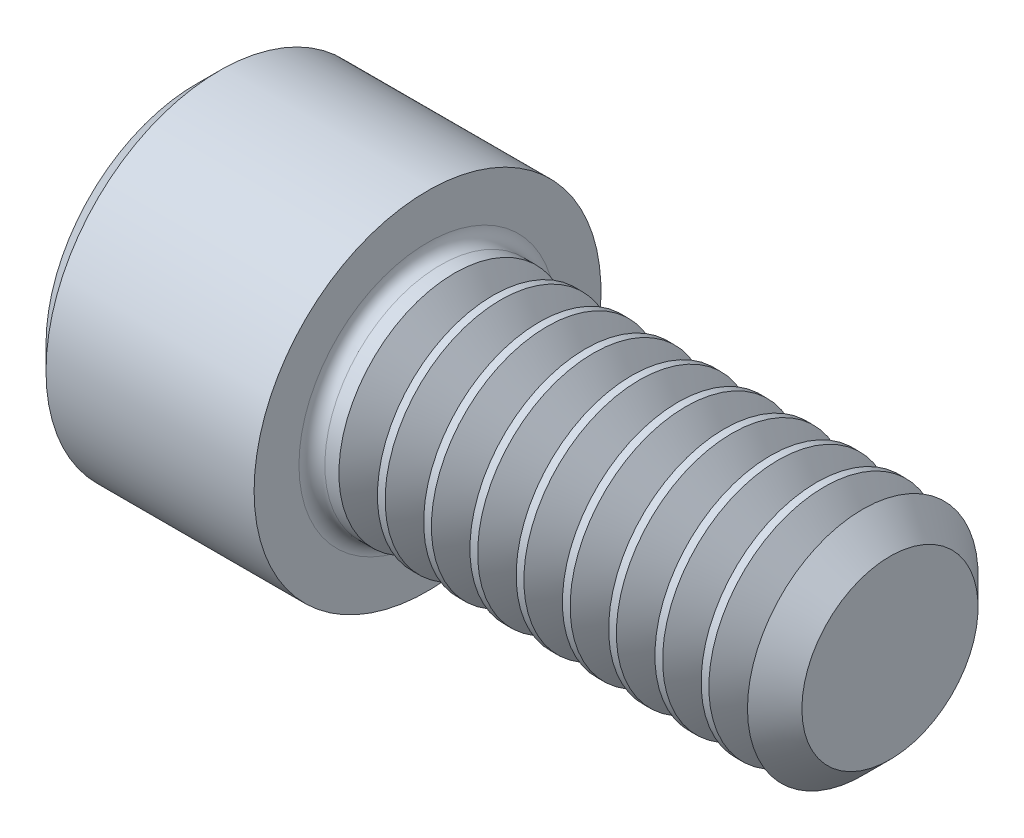
ISO-10303-21;
HEADER;
FILE_DESCRIPTION(('STEP AP214'),'2;1');
FILE_NAME('part.step','',(''),(''),'','','');
FILE_SCHEMA(('AUTOMOTIVE_DESIGN { 1 0 10303 214 1 1 1 1 }'));
ENDSEC;
DATA;
#1=APPLICATION_CONTEXT('core data for automotive mechanical design processes');
#2=APPLICATION_PROTOCOL_DEFINITION('international standard','automotive_design',2000,#1);
#3=PRODUCT_CONTEXT('',#1,'mechanical');
#4=PRODUCT('Part','Part','',(#3));
#5=PRODUCT_RELATED_PRODUCT_CATEGORY('part','',(#4));
#6=PRODUCT_DEFINITION_FORMATION('','',#4);
#7=PRODUCT_DEFINITION_CONTEXT('part definition',#1,'design');
#8=PRODUCT_DEFINITION('design','',#6,#7);
#9=PRODUCT_DEFINITION_SHAPE('','',#8);
#10=(LENGTH_UNIT() NAMED_UNIT(*) SI_UNIT(.MILLI.,.METRE.));
#11=(NAMED_UNIT(*) PLANE_ANGLE_UNIT() SI_UNIT($,.RADIAN.));
#12=(NAMED_UNIT(*) SI_UNIT($,.STERADIAN.) SOLID_ANGLE_UNIT());
#13=UNCERTAINTY_MEASURE_WITH_UNIT(LENGTH_MEASURE(1.E-05),#10,'distance_accuracy_value','');
#14=(GEOMETRIC_REPRESENTATION_CONTEXT(3) GLOBAL_UNCERTAINTY_ASSIGNED_CONTEXT((#13)) GLOBAL_UNIT_ASSIGNED_CONTEXT((#10,
#11,#12)) REPRESENTATION_CONTEXT('',''));
#15=CARTESIAN_POINT('',(0.,0.,0.));
#16=DIRECTION('',(0.,0.,1.));
#17=DIRECTION('',(1.,0.,0.));
#18=AXIS2_PLACEMENT_3D('',#15,#16,#17);
#19=CARTESIAN_POINT('',(0.,0.,0.));
#20=DIRECTION('',(-1.,0.,0.));
#21=DIRECTION('',(0.,0.,1.));
#22=AXIS2_PLACEMENT_3D('',#19,#20,#21);
#23=PLANE('',#22);
#24=DIRECTION('',(0.,-0.499999999999998,0.86602540378444));
#25=VECTOR('',#24,1.);
#26=CARTESIAN_POINT('',(0.,2.74963065701559,0.));
#27=LINE('',#26,#25);
#28=CARTESIAN_POINT('',(0.,2.74963065701559,0.));
#29=VERTEX_POINT('',#28);
#30=CARTESIAN_POINT('',(0.,1.3748153285078,2.38125));
#31=VERTEX_POINT('',#30);
#32=EDGE_CURVE('E630',#29,#31,#27,.T.);
#33=ORIENTED_EDGE('',*,*,#32,.T.);
#34=DIRECTION('',(0.,1.,0.));
#35=VECTOR('',#34,1.);
#36=CARTESIAN_POINT('',(0.,-1.37481532850779,2.38125));
#37=LINE('',#36,#35);
#38=CARTESIAN_POINT('',(0.,-1.37481532850779,2.38125));
#39=VERTEX_POINT('',#38);
#40=EDGE_CURVE('E136',#39,#31,#37,.T.);
#41=ORIENTED_EDGE('',*,*,#40,.F.);
#42=DIRECTION('',(0.,-0.500000000000001,-0.866025403784438));
#43=VECTOR('',#42,1.);
#44=CARTESIAN_POINT('',(0.,-1.37481532850779,2.38125));
#45=LINE('',#44,#43);
#46=CARTESIAN_POINT('',(0.,-2.74963065701559,0.));
#47=VERTEX_POINT('',#46);
#48=EDGE_CURVE('E649',#39,#47,#45,.T.);
#49=ORIENTED_EDGE('',*,*,#48,.T.);
#50=DIRECTION('',(0.,0.499999999999998,-0.86602540378444));
#51=VECTOR('',#50,1.);
#52=CARTESIAN_POINT('',(0.,-2.74963065701559,0.));
#53=LINE('',#52,#51);
#54=CARTESIAN_POINT('',(0.,-1.3748153285078,-2.38125));
#55=VERTEX_POINT('',#54);
#56=EDGE_CURVE('E652',#47,#55,#53,.T.);
#57=ORIENTED_EDGE('',*,*,#56,.T.);
#58=DIRECTION('',(0.,-1.,0.));
#59=VECTOR('',#58,1.);
#60=CARTESIAN_POINT('',(0.,1.37481532850779,-2.38125));
#61=LINE('',#60,#59);
#62=CARTESIAN_POINT('',(0.,1.37481532850779,-2.38125));
#63=VERTEX_POINT('',#62);
#64=EDGE_CURVE('E655',#63,#55,#61,.T.);
#65=ORIENTED_EDGE('',*,*,#64,.F.);
#66=DIRECTION('',(0.,-0.500000000000001,-0.866025403784438));
#67=VECTOR('',#66,1.);
#68=CARTESIAN_POINT('',(0.,2.74963065701559,0.));
#69=LINE('',#68,#67);
#70=EDGE_CURVE('E131',#29,#63,#69,.T.);
#71=ORIENTED_EDGE('',*,*,#70,.F.);
#72=EDGE_LOOP('',(#33,#41,#49,#57,#65,#71));
#73=FACE_BOUND('',#72,.T.);
#74=CARTESIAN_POINT('',(0.,0.,0.));
#75=DIRECTION('',(-1.,0.,0.));
#76=DIRECTION('',(0.,0.,1.));
#77=AXIS2_PLACEMENT_3D('',#74,#75,#76);
#78=CIRCLE('',#77,4.1275);
#79=CARTESIAN_POINT('',(0.,0.,4.1275));
#80=VERTEX_POINT('',#79);
#81=EDGE_CURVE('E147',#80,#80,#78,.T.);
#82=ORIENTED_EDGE('',*,*,#81,.T.);
#83=EDGE_LOOP('',(#82));
#84=FACE_BOUND('',#83,.T.);
#85=ADVANCED_FACE('F39',(#73,#84),#23,.T.);
#86=CARTESIAN_POINT('',(-31.75,0.,0.));
#87=DIRECTION('',(-1.,0.,0.));
#88=DIRECTION('',(0.,0.,1.));
#89=AXIS2_PLACEMENT_3D('',#86,#87,#88);
#90=CYLINDRICAL_SURFACE('',#89,3.175);
#91=CARTESIAN_POINT('',(7.09088817375183,0.,0.));
#92=DIRECTION('',(-1.,0.,0.));
#93=DIRECTION('',(0.,-1.,0.));
#94=AXIS2_PLACEMENT_3D('',#91,#92,#93);
#95=CIRCLE('',#94,3.175);
#96=CARTESIAN_POINT('',(7.09088817375183,-3.175,0.));
#97=VERTEX_POINT('',#96);
#98=EDGE_CURVE('E625',#97,#97,#95,.T.);
#99=ORIENTED_EDGE('',*,*,#98,.T.);
#100=EDGE_LOOP('',(#99));
#101=FACE_BOUND('',#100,.T.);
#102=CARTESIAN_POINT('',(6.7056,0.,0.));
#103=DIRECTION('',(1.,0.,0.));
#104=DIRECTION('',(0.,0.,-1.));
#105=AXIS2_PLACEMENT_3D('',#102,#103,#104);
#106=CIRCLE('',#105,3.175);
#107=CARTESIAN_POINT('',(6.7056,0.,-3.175));
#108=VERTEX_POINT('',#107);
#109=EDGE_CURVE('E11',#108,#108,#106,.T.);
#110=ORIENTED_EDGE('',*,*,#109,.T.);
#111=EDGE_LOOP('',(#110));
#112=FACE_BOUND('',#111,.T.);
#113=ADVANCED_FACE('F180',(#101,#112),#90,.T.);
#114=CARTESIAN_POINT('',(6.35,4.7625,0.));
#115=DIRECTION('',(1.,0.,0.));
#116=DIRECTION('',(0.,0.,-1.));
#117=AXIS2_PLACEMENT_3D('',#114,#115,#116);
#118=PLANE('',#117);
#119=CARTESIAN_POINT('',(6.35,0.,0.));
#120=DIRECTION('',(1.,0.,0.));
#121=DIRECTION('',(0.,0.,-1.));
#122=AXIS2_PLACEMENT_3D('',#119,#120,#121);
#123=CIRCLE('',#122,3.5306);
#124=CARTESIAN_POINT('',(6.35,0.,-3.5306));
#125=VERTEX_POINT('',#124);
#126=EDGE_CURVE('E48',#125,#125,#123,.F.);
#127=ORIENTED_EDGE('',*,*,#126,.T.);
#128=EDGE_LOOP('',(#127));
#129=FACE_BOUND('',#128,.T.);
#130=CARTESIAN_POINT('',(6.35,0.,0.));
#131=DIRECTION('',(-1.,0.,0.));
#132=DIRECTION('',(0.,0.,1.));
#133=AXIS2_PLACEMENT_3D('',#130,#131,#132);
#134=CIRCLE('',#133,4.7625);
#135=CARTESIAN_POINT('',(6.35,0.,4.7625));
#136=VERTEX_POINT('',#135);
#137=EDGE_CURVE('E154',#136,#136,#134,.T.);
#138=ORIENTED_EDGE('',*,*,#137,.F.);
#139=EDGE_LOOP('',(#138));
#140=FACE_BOUND('',#139,.T.);
#141=ADVANCED_FACE('F163',(#129,#140),#118,.T.);
#142=CARTESIAN_POINT('',(-31.75,0.,0.));
#143=DIRECTION('',(-1.,0.,0.));
#144=DIRECTION('',(0.,0.,1.));
#145=AXIS2_PLACEMENT_3D('',#142,#143,#144);
#146=CYLINDRICAL_SURFACE('',#145,4.7625);
#147=ORIENTED_EDGE('',*,*,#137,.T.);
#148=EDGE_LOOP('',(#147));
#149=FACE_BOUND('',#148,.T.);
#150=CARTESIAN_POINT('',(0.634999999999997,0.,0.));
#151=DIRECTION('',(-1.,0.,0.));
#152=DIRECTION('',(0.,0.,1.));
#153=AXIS2_PLACEMENT_3D('',#150,#151,#152);
#154=CIRCLE('',#153,4.7625);
#155=CARTESIAN_POINT('',(0.634999999999997,0.,4.7625));
#156=VERTEX_POINT('',#155);
#157=EDGE_CURVE('E151',#156,#156,#154,.T.);
#158=ORIENTED_EDGE('',*,*,#157,.F.);
#159=EDGE_LOOP('',(#158));
#160=FACE_BOUND('',#159,.T.);
#161=ADVANCED_FACE('F176',(#149,#160),#146,.T.);
#162=CARTESIAN_POINT('',(0.,0.,0.));
#163=DIRECTION('',(1.,0.,0.));
#164=DIRECTION('',(0.,0.,-1.));
#165=AXIS2_PLACEMENT_3D('',#162,#163,#164);
#166=CONICAL_SURFACE('',#165,4.1275,0.785398163397452);
#167=ORIENTED_EDGE('',*,*,#157,.T.);
#168=EDGE_LOOP('',(#167));
#169=FACE_BOUND('',#168,.T.);
#170=ORIENTED_EDGE('',*,*,#81,.F.);
#171=EDGE_LOOP('',(#170));
#172=FACE_BOUND('',#171,.T.);
#173=ADVANCED_FACE('F167',(#169,#172),#166,.T.);
#174=CARTESIAN_POINT('',(6.7056,0.,0.));
#175=DIRECTION('',(1.,0.,0.));
#176=DIRECTION('',(0.,0.,-1.));
#177=AXIS2_PLACEMENT_3D('',#174,#175,#176);
#178=TOROIDAL_SURFACE('',#177,3.5306,0.3556);
#179=ORIENTED_EDGE('',*,*,#109,.F.);
#180=EDGE_LOOP('',(#179));
#181=FACE_BOUND('',#180,.T.);
#182=ORIENTED_EDGE('',*,*,#126,.F.);
#183=EDGE_LOOP('',(#182));
#184=FACE_BOUND('',#183,.T.);
#185=ADVANCED_FACE('F41',(#181,#184),#178,.F.);
#186=CARTESIAN_POINT('',(3.048,2.74963065701559,0.));
#187=DIRECTION('',(0.,-0.86602540378444,-0.499999999999998));
#188=DIRECTION('',(0.,0.499999999999998,-0.86602540378444));
#189=AXIS2_PLACEMENT_3D('',#186,#187,#188);
#190=PLANE('',#189);
#191=ORIENTED_EDGE('',*,*,#32,.F.);
#192=DIRECTION('',(-1.,0.,0.));
#193=VECTOR('',#192,1.);
#194=CARTESIAN_POINT('',(3.048,2.74963065701559,0.));
#195=LINE('',#194,#193);
#196=CARTESIAN_POINT('',(3.048,2.74963065701559,0.));
#197=VERTEX_POINT('',#196);
#198=EDGE_CURVE('E646',#197,#29,#195,.T.);
#199=ORIENTED_EDGE('',*,*,#198,.F.);
#200=DIRECTION('',(0.,-0.499999999999998,0.86602540378444));
#201=VECTOR('',#200,1.);
#202=CARTESIAN_POINT('',(3.048,2.74963065701559,0.));
#203=LINE('',#202,#201);
#204=CARTESIAN_POINT('',(3.048,2.0622229927617,1.190625));
#205=VERTEX_POINT('',#204);
#206=EDGE_CURVE('E123',#197,#205,#203,.T.);
#207=ORIENTED_EDGE('',*,*,#206,.T.);
#208=CARTESIAN_POINT('',(3.048,1.3748153285078,2.38125));
#209=VERTEX_POINT('',#208);
#210=EDGE_CURVE('E114',#205,#209,#203,.T.);
#211=ORIENTED_EDGE('',*,*,#210,.T.);
#212=DIRECTION('',(-1.,0.,0.));
#213=VECTOR('',#212,1.);
#214=CARTESIAN_POINT('',(3.048,1.3748153285078,2.38125));
#215=LINE('',#214,#213);
#216=EDGE_CURVE('E128',#209,#31,#215,.T.);
#217=ORIENTED_EDGE('',*,*,#216,.T.);
#218=EDGE_LOOP('',(#191,#199,#207,#211,#217));
#219=FACE_BOUND('',#218,.T.);
#220=ADVANCED_FACE('F127',(#219),#190,.T.);
#221=CARTESIAN_POINT('',(3.048,-1.37481532850779,2.38125));
#222=DIRECTION('',(0.,0.,1.));
#223=DIRECTION('',(0.,-1.,0.));
#224=AXIS2_PLACEMENT_3D('',#221,#222,#223);
#225=PLANE('',#224);
#226=ORIENTED_EDGE('',*,*,#40,.T.);
#227=ORIENTED_EDGE('',*,*,#216,.F.);
#228=DIRECTION('',(0.,1.,0.));
#229=VECTOR('',#228,1.);
#230=CARTESIAN_POINT('',(3.048,-1.37481532850779,2.38125));
#231=LINE('',#230,#229);
#232=CARTESIAN_POINT('',(3.048,0.,2.38125));
#233=VERTEX_POINT('',#232);
#234=EDGE_CURVE('E111',#233,#209,#231,.T.);
#235=ORIENTED_EDGE('',*,*,#234,.F.);
#236=CARTESIAN_POINT('',(3.048,-1.37481532850779,2.38125));
#237=VERTEX_POINT('',#236);
#238=EDGE_CURVE('E122',#237,#233,#231,.T.);
#239=ORIENTED_EDGE('',*,*,#238,.F.);
#240=DIRECTION('',(-1.,0.,0.));
#241=VECTOR('',#240,1.);
#242=CARTESIAN_POINT('',(3.048,-1.37481532850779,2.38125));
#243=LINE('',#242,#241);
#244=EDGE_CURVE('E138',#237,#39,#243,.T.);
#245=ORIENTED_EDGE('',*,*,#244,.T.);
#246=EDGE_LOOP('',(#226,#227,#235,#239,#245));
#247=FACE_BOUND('',#246,.T.);
#248=ADVANCED_FACE('F133',(#247),#225,.F.);
#249=CARTESIAN_POINT('',(3.048,-1.37481532850779,2.38125));
#250=DIRECTION('',(0.,0.866025403784438,-0.500000000000001));
#251=DIRECTION('',(0.,0.500000000000001,0.866025403784438));
#252=AXIS2_PLACEMENT_3D('',#249,#250,#251);
#253=PLANE('',#252);
#254=ORIENTED_EDGE('',*,*,#48,.F.);
#255=ORIENTED_EDGE('',*,*,#244,.F.);
#256=DIRECTION('',(0.,-0.500000000000001,-0.866025403784438));
#257=VECTOR('',#256,1.);
#258=CARTESIAN_POINT('',(3.048,-1.37481532850779,2.38125));
#259=LINE('',#258,#257);
#260=CARTESIAN_POINT('',(3.048,-2.06222299276169,1.190625));
#261=VERTEX_POINT('',#260);
#262=EDGE_CURVE('E633',#237,#261,#259,.T.);
#263=ORIENTED_EDGE('',*,*,#262,.T.);
#264=CARTESIAN_POINT('',(3.048,-2.74963065701559,0.));
#265=VERTEX_POINT('',#264);
#266=EDGE_CURVE('E632',#261,#265,#259,.T.);
#267=ORIENTED_EDGE('',*,*,#266,.T.);
#268=DIRECTION('',(-1.,0.,0.));
#269=VECTOR('',#268,1.);
#270=CARTESIAN_POINT('',(3.048,-2.74963065701559,0.));
#271=LINE('',#270,#269);
#272=EDGE_CURVE('E143',#265,#47,#271,.T.);
#273=ORIENTED_EDGE('',*,*,#272,.T.);
#274=EDGE_LOOP('',(#254,#255,#263,#267,#273));
#275=FACE_BOUND('',#274,.T.);
#276=ADVANCED_FACE('F308',(#275),#253,.T.);
#277=CARTESIAN_POINT('',(3.048,-2.74963065701559,0.));
#278=DIRECTION('',(0.,0.86602540378444,0.499999999999998));
#279=DIRECTION('',(0.,-0.499999999999998,0.86602540378444));
#280=AXIS2_PLACEMENT_3D('',#277,#278,#279);
#281=PLANE('',#280);
#282=ORIENTED_EDGE('',*,*,#56,.F.);
#283=ORIENTED_EDGE('',*,*,#272,.F.);
#284=DIRECTION('',(0.,0.499999999999998,-0.86602540378444));
#285=VECTOR('',#284,1.);
#286=CARTESIAN_POINT('',(3.048,-2.74963065701559,0.));
#287=LINE('',#286,#285);
#288=CARTESIAN_POINT('',(3.048,-2.0622229927617,-1.19062499999999));
#289=VERTEX_POINT('',#288);
#290=EDGE_CURVE('E637',#265,#289,#287,.T.);
#291=ORIENTED_EDGE('',*,*,#290,.T.);
#292=CARTESIAN_POINT('',(3.048,-1.3748153285078,-2.38125));
#293=VERTEX_POINT('',#292);
#294=EDGE_CURVE('E636',#289,#293,#287,.T.);
#295=ORIENTED_EDGE('',*,*,#294,.T.);
#296=DIRECTION('',(-1.,0.,0.));
#297=VECTOR('',#296,1.);
#298=CARTESIAN_POINT('',(3.048,-1.3748153285078,-2.38125));
#299=LINE('',#298,#297);
#300=EDGE_CURVE('E664',#293,#55,#299,.T.);
#301=ORIENTED_EDGE('',*,*,#300,.T.);
#302=EDGE_LOOP('',(#282,#283,#291,#295,#301));
#303=FACE_BOUND('',#302,.T.);
#304=ADVANCED_FACE('F304',(#303),#281,.T.);
#305=CARTESIAN_POINT('',(3.048,1.37481532850779,-2.38125));
#306=DIRECTION('',(0.,0.,-1.));
#307=DIRECTION('',(0.,1.,0.));
#308=AXIS2_PLACEMENT_3D('',#305,#306,#307);
#309=PLANE('',#308);
#310=ORIENTED_EDGE('',*,*,#64,.T.);
#311=ORIENTED_EDGE('',*,*,#300,.F.);
#312=DIRECTION('',(0.,-1.,0.));
#313=VECTOR('',#312,1.);
#314=CARTESIAN_POINT('',(3.048,1.37481532850779,-2.38125));
#315=LINE('',#314,#313);
#316=CARTESIAN_POINT('',(3.048,0.,-2.38125));
#317=VERTEX_POINT('',#316);
#318=EDGE_CURVE('E640',#317,#293,#315,.T.);
#319=ORIENTED_EDGE('',*,*,#318,.F.);
#320=CARTESIAN_POINT('',(3.048,1.37481532850779,-2.38125));
#321=VERTEX_POINT('',#320);
#322=EDGE_CURVE('E55',#321,#317,#315,.T.);
#323=ORIENTED_EDGE('',*,*,#322,.F.);
#324=DIRECTION('',(-1.,0.,0.));
#325=VECTOR('',#324,1.);
#326=CARTESIAN_POINT('',(3.048,1.37481532850779,-2.38125));
#327=LINE('',#326,#325);
#328=EDGE_CURVE('E661',#321,#63,#327,.T.);
#329=ORIENTED_EDGE('',*,*,#328,.T.);
#330=EDGE_LOOP('',(#310,#311,#319,#323,#329));
#331=FACE_BOUND('',#330,.T.);
#332=ADVANCED_FACE('F300',(#331),#309,.F.);
#333=CARTESIAN_POINT('',(3.048,2.74963065701559,0.));
#334=DIRECTION('',(0.,0.866025403784438,-0.500000000000001));
#335=DIRECTION('',(0.,0.500000000000001,0.866025403784438));
#336=AXIS2_PLACEMENT_3D('',#333,#334,#335);
#337=PLANE('',#336);
#338=ORIENTED_EDGE('',*,*,#70,.T.);
#339=ORIENTED_EDGE('',*,*,#328,.F.);
#340=DIRECTION('',(0.,-0.500000000000001,-0.866025403784438));
#341=VECTOR('',#340,1.);
#342=CARTESIAN_POINT('',(3.048,2.74963065701559,0.));
#343=LINE('',#342,#341);
#344=CARTESIAN_POINT('',(3.048,2.06222299276169,-1.190625));
#345=VERTEX_POINT('',#344);
#346=EDGE_CURVE('E642',#345,#321,#343,.T.);
#347=ORIENTED_EDGE('',*,*,#346,.F.);
#348=EDGE_CURVE('E643',#197,#345,#343,.T.);
#349=ORIENTED_EDGE('',*,*,#348,.F.);
#350=ORIENTED_EDGE('',*,*,#198,.T.);
#351=EDGE_LOOP('',(#338,#339,#347,#349,#350));
#352=FACE_BOUND('',#351,.T.);
#353=ADVANCED_FACE('F295',(#352),#337,.F.);
#354=CARTESIAN_POINT('',(3.048,4.12444598552338,-2.38125));
#355=DIRECTION('',(1.,0.,0.));
#356=DIRECTION('',(0.,0.,-1.));
#357=AXIS2_PLACEMENT_3D('',#354,#355,#356);
#358=PLANE('',#357);
#359=ORIENTED_EDGE('',*,*,#318,.T.);
#360=ORIENTED_EDGE('',*,*,#294,.F.);
#361=CARTESIAN_POINT('',(3.048,0.,0.));
#362=DIRECTION('',(-1.,0.,0.));
#363=DIRECTION('',(0.,0.,1.));
#364=AXIS2_PLACEMENT_3D('',#361,#362,#363);
#365=CIRCLE('',#364,2.38125);
#366=EDGE_CURVE('E679',#317,#289,#365,.T.);
#367=ORIENTED_EDGE('',*,*,#366,.F.);
#368=EDGE_LOOP('',(#359,#360,#367));
#369=FACE_BOUND('',#368,.T.);
#370=ADVANCED_FACE('F291',(#369),#358,.F.);
#371=ORIENTED_EDGE('',*,*,#290,.F.);
#372=ORIENTED_EDGE('',*,*,#266,.F.);
#373=EDGE_CURVE('E141',#289,#261,#365,.T.);
#374=ORIENTED_EDGE('',*,*,#373,.F.);
#375=EDGE_LOOP('',(#371,#372,#374));
#376=FACE_BOUND('',#375,.T.);
#377=ADVANCED_FACE('F294',(#376),#358,.F.);
#378=ORIENTED_EDGE('',*,*,#262,.F.);
#379=ORIENTED_EDGE('',*,*,#238,.T.);
#380=EDGE_CURVE('E137',#261,#233,#365,.T.);
#381=ORIENTED_EDGE('',*,*,#380,.F.);
#382=EDGE_LOOP('',(#378,#379,#381));
#383=FACE_BOUND('',#382,.T.);
#384=ADVANCED_FACE('F350',(#383),#358,.F.);
#385=ORIENTED_EDGE('',*,*,#234,.T.);
#386=ORIENTED_EDGE('',*,*,#210,.F.);
#387=EDGE_CURVE('E117',#233,#205,#365,.T.);
#388=ORIENTED_EDGE('',*,*,#387,.F.);
#389=EDGE_LOOP('',(#385,#386,#388));
#390=FACE_BOUND('',#389,.T.);
#391=ADVANCED_FACE('F113',(#390),#358,.F.);
#392=ORIENTED_EDGE('',*,*,#206,.F.);
#393=ORIENTED_EDGE('',*,*,#348,.T.);
#394=EDGE_CURVE('E148',#205,#345,#365,.T.);
#395=ORIENTED_EDGE('',*,*,#394,.F.);
#396=EDGE_LOOP('',(#392,#393,#395));
#397=FACE_BOUND('',#396,.T.);
#398=ADVANCED_FACE('F365',(#397),#358,.F.);
#399=ORIENTED_EDGE('',*,*,#346,.T.);
#400=ORIENTED_EDGE('',*,*,#322,.T.);
#401=EDGE_CURVE('E678',#345,#317,#365,.T.);
#402=ORIENTED_EDGE('',*,*,#401,.F.);
#403=EDGE_LOOP('',(#399,#400,#402));
#404=FACE_BOUND('',#403,.T.);
#405=ADVANCED_FACE('F297',(#404),#358,.F.);
#406=CARTESIAN_POINT('',(3.048,0.,0.));
#407=DIRECTION('',(-1.,0.,0.));
#408=DIRECTION('',(0.,0.,1.));
#409=AXIS2_PLACEMENT_3D('',#406,#407,#408);
#410=CONICAL_SURFACE('',#409,2.38125,1.04719755119659);
#411=CARTESIAN_POINT('',(4.42281532850781,0.,0.));
#412=VERTEX_POINT('',#411);
#413=VERTEX_LOOP('',#412);
#414=FACE_BOUND('',#413,.T.);
#415=ORIENTED_EDGE('',*,*,#387,.T.);
#416=ORIENTED_EDGE('',*,*,#394,.T.);
#417=ORIENTED_EDGE('',*,*,#401,.T.);
#418=ORIENTED_EDGE('',*,*,#366,.T.);
#419=ORIENTED_EDGE('',*,*,#373,.T.);
#420=ORIENTED_EDGE('',*,*,#380,.T.);
#421=EDGE_LOOP('',(#415,#416,#417,#418,#419,#420));
#422=FACE_BOUND('',#421,.T.);
#423=ADVANCED_FACE('F192',(#414,#422),#410,.F.);
#424=CARTESIAN_POINT('',(8.14911182624816,0.,0.));
#425=DIRECTION('',(1.,0.,0.));
#426=DIRECTION('',(0.,1.,0.));
#427=AXIS2_PLACEMENT_3D('',#424,#425,#426);
#428=CONICAL_SURFACE('',#427,3.175,0.959931088596884);
#429=CARTESIAN_POINT('',(7.62,0.,0.));
#430=DIRECTION('',(-1.,0.,0.));
#431=DIRECTION('',(0.,-1.,0.));
#432=AXIS2_PLACEMENT_3D('',#429,#430,#431);
#433=CIRCLE('',#432,2.41935);
#434=CARTESIAN_POINT('',(7.62,-2.41935,0.));
#435=VERTEX_POINT('',#434);
#436=EDGE_CURVE('E622',#435,#435,#433,.T.);
#437=ORIENTED_EDGE('',*,*,#436,.F.);
#438=EDGE_LOOP('',(#437));
#439=FACE_BOUND('',#438,.T.);
#440=CARTESIAN_POINT('',(8.14911182624816,0.,0.));
#441=DIRECTION('',(-1.,0.,0.));
#442=DIRECTION('',(0.,-1.,0.));
#443=AXIS2_PLACEMENT_3D('',#440,#441,#442);
#444=CIRCLE('',#443,3.175);
#445=CARTESIAN_POINT('',(8.14911182624816,-3.175,0.));
#446=VERTEX_POINT('',#445);
#447=EDGE_CURVE('E628',#446,#446,#444,.T.);
#448=ORIENTED_EDGE('',*,*,#447,.T.);
#449=EDGE_LOOP('',(#448));
#450=FACE_BOUND('',#449,.T.);
#451=ADVANCED_FACE('F286',(#439,#450),#428,.T.);
#452=CARTESIAN_POINT('',(7.62,0.,0.));
#453=DIRECTION('',(-1.,0.,0.));
#454=DIRECTION('',(0.,-1.,0.));
#455=AXIS2_PLACEMENT_3D('',#452,#453,#454);
#456=CONICAL_SURFACE('',#455,2.41935,0.959931088596876);
#457=ORIENTED_EDGE('',*,*,#98,.F.);
#458=EDGE_LOOP('',(#457));
#459=FACE_BOUND('',#458,.T.);
#460=ORIENTED_EDGE('',*,*,#436,.T.);
#461=EDGE_LOOP('',(#460));
#462=FACE_BOUND('',#461,.T.);
#463=ADVANCED_FACE('F283',(#459,#462),#456,.T.);
#464=CARTESIAN_POINT('',(8.36088817375183,0.,0.));
#465=DIRECTION('',(-1.,0.,0.));
#466=DIRECTION('',(0.,-1.,0.));
#467=AXIS2_PLACEMENT_3D('',#464,#465,#466);
#468=CIRCLE('',#467,3.175);
#469=CARTESIAN_POINT('',(8.36088817375183,-3.175,0.));
#470=VERTEX_POINT('',#469);
#471=EDGE_CURVE('E616',#470,#470,#468,.T.);
#472=ORIENTED_EDGE('',*,*,#471,.T.);
#473=EDGE_LOOP('',(#472));
#474=FACE_BOUND('',#473,.T.);
#475=ORIENTED_EDGE('',*,*,#447,.F.);
#476=EDGE_LOOP('',(#475));
#477=FACE_BOUND('',#476,.T.);
#478=ADVANCED_FACE('F189',(#474,#477),#90,.T.);
#479=CARTESIAN_POINT('',(9.41911182624816,0.,0.));
#480=DIRECTION('',(1.,0.,0.));
#481=DIRECTION('',(0.,1.,0.));
#482=AXIS2_PLACEMENT_3D('',#479,#480,#481);
#483=CONICAL_SURFACE('',#482,3.175,0.959931088596884);
#484=CARTESIAN_POINT('',(8.89,0.,0.));
#485=DIRECTION('',(-1.,0.,0.));
#486=DIRECTION('',(0.,-1.,0.));
#487=AXIS2_PLACEMENT_3D('',#484,#485,#486);
#488=CIRCLE('',#487,2.41935);
#489=CARTESIAN_POINT('',(8.89,-2.41935,0.));
#490=VERTEX_POINT('',#489);
#491=EDGE_CURVE('E613',#490,#490,#488,.T.);
#492=ORIENTED_EDGE('',*,*,#491,.F.);
#493=EDGE_LOOP('',(#492));
#494=FACE_BOUND('',#493,.T.);
#495=CARTESIAN_POINT('',(9.41911182624816,0.,0.));
#496=DIRECTION('',(-1.,0.,0.));
#497=DIRECTION('',(0.,-1.,0.));
#498=AXIS2_PLACEMENT_3D('',#495,#496,#497);
#499=CIRCLE('',#498,3.175);
#500=CARTESIAN_POINT('',(9.41911182624816,-3.175,0.));
#501=VERTEX_POINT('',#500);
#502=EDGE_CURVE('E619',#501,#501,#499,.T.);
#503=ORIENTED_EDGE('',*,*,#502,.T.);
#504=EDGE_LOOP('',(#503));
#505=FACE_BOUND('',#504,.T.);
#506=ADVANCED_FACE('F278',(#494,#505),#483,.T.);
#507=CARTESIAN_POINT('',(8.89,0.,0.));
#508=DIRECTION('',(-1.,0.,0.));
#509=DIRECTION('',(0.,-1.,0.));
#510=AXIS2_PLACEMENT_3D('',#507,#508,#509);
#511=CONICAL_SURFACE('',#510,2.41935,0.959931088596876);
#512=ORIENTED_EDGE('',*,*,#471,.F.);
#513=EDGE_LOOP('',(#512));
#514=FACE_BOUND('',#513,.T.);
#515=ORIENTED_EDGE('',*,*,#491,.T.);
#516=EDGE_LOOP('',(#515));
#517=FACE_BOUND('',#516,.T.);
#518=ADVANCED_FACE('F275',(#514,#517),#511,.T.);
#519=CARTESIAN_POINT('',(9.63088817375183,0.,0.));
#520=DIRECTION('',(-1.,0.,0.));
#521=DIRECTION('',(0.,-1.,0.));
#522=AXIS2_PLACEMENT_3D('',#519,#520,#521);
#523=CIRCLE('',#522,3.175);
#524=CARTESIAN_POINT('',(9.63088817375183,-3.175,0.));
#525=VERTEX_POINT('',#524);
#526=EDGE_CURVE('E607',#525,#525,#523,.T.);
#527=ORIENTED_EDGE('',*,*,#526,.T.);
#528=EDGE_LOOP('',(#527));
#529=FACE_BOUND('',#528,.T.);
#530=ORIENTED_EDGE('',*,*,#502,.F.);
#531=EDGE_LOOP('',(#530));
#532=FACE_BOUND('',#531,.T.);
#533=ADVANCED_FACE('F273',(#529,#532),#90,.T.);
#534=CARTESIAN_POINT('',(10.6891118262482,0.,0.));
#535=DIRECTION('',(1.,0.,0.));
#536=DIRECTION('',(0.,1.,0.));
#537=AXIS2_PLACEMENT_3D('',#534,#535,#536);
#538=CONICAL_SURFACE('',#537,3.175,0.959931088596884);
#539=CARTESIAN_POINT('',(10.16,0.,0.));
#540=DIRECTION('',(-1.,0.,0.));
#541=DIRECTION('',(0.,-1.,0.));
#542=AXIS2_PLACEMENT_3D('',#539,#540,#541);
#543=CIRCLE('',#542,2.41935);
#544=CARTESIAN_POINT('',(10.16,-2.41935,0.));
#545=VERTEX_POINT('',#544);
#546=EDGE_CURVE('E604',#545,#545,#543,.T.);
#547=ORIENTED_EDGE('',*,*,#546,.F.);
#548=EDGE_LOOP('',(#547));
#549=FACE_BOUND('',#548,.T.);
#550=CARTESIAN_POINT('',(10.6891118262482,0.,0.));
#551=DIRECTION('',(-1.,0.,0.));
#552=DIRECTION('',(0.,-1.,0.));
#553=AXIS2_PLACEMENT_3D('',#550,#551,#552);
#554=CIRCLE('',#553,3.175);
#555=CARTESIAN_POINT('',(10.6891118262482,-3.175,0.));
#556=VERTEX_POINT('',#555);
#557=EDGE_CURVE('E610',#556,#556,#554,.T.);
#558=ORIENTED_EDGE('',*,*,#557,.T.);
#559=EDGE_LOOP('',(#558));
#560=FACE_BOUND('',#559,.T.);
#561=ADVANCED_FACE('F269',(#549,#560),#538,.T.);
#562=CARTESIAN_POINT('',(10.16,0.,0.));
#563=DIRECTION('',(-1.,0.,0.));
#564=DIRECTION('',(0.,-1.,0.));
#565=AXIS2_PLACEMENT_3D('',#562,#563,#564);
#566=CONICAL_SURFACE('',#565,2.41935,0.959931088596876);
#567=ORIENTED_EDGE('',*,*,#526,.F.);
#568=EDGE_LOOP('',(#567));
#569=FACE_BOUND('',#568,.T.);
#570=ORIENTED_EDGE('',*,*,#546,.T.);
#571=EDGE_LOOP('',(#570));
#572=FACE_BOUND('',#571,.T.);
#573=ADVANCED_FACE('F266',(#569,#572),#566,.T.);
#574=CARTESIAN_POINT('',(10.9008881737518,0.,0.));
#575=DIRECTION('',(-1.,0.,0.));
#576=DIRECTION('',(0.,-1.,0.));
#577=AXIS2_PLACEMENT_3D('',#574,#575,#576);
#578=CIRCLE('',#577,3.175);
#579=CARTESIAN_POINT('',(10.9008881737518,-3.175,0.));
#580=VERTEX_POINT('',#579);
#581=EDGE_CURVE('E598',#580,#580,#578,.T.);
#582=ORIENTED_EDGE('',*,*,#581,.T.);
#583=EDGE_LOOP('',(#582));
#584=FACE_BOUND('',#583,.T.);
#585=ORIENTED_EDGE('',*,*,#557,.F.);
#586=EDGE_LOOP('',(#585));
#587=FACE_BOUND('',#586,.T.);
#588=ADVANCED_FACE('F264',(#584,#587),#90,.T.);
#589=CARTESIAN_POINT('',(11.9591118262482,0.,0.));
#590=DIRECTION('',(1.,0.,0.));
#591=DIRECTION('',(0.,1.,0.));
#592=AXIS2_PLACEMENT_3D('',#589,#590,#591);
#593=CONICAL_SURFACE('',#592,3.175,0.959931088596884);
#594=CARTESIAN_POINT('',(11.43,0.,0.));
#595=DIRECTION('',(-1.,0.,0.));
#596=DIRECTION('',(0.,-1.,0.));
#597=AXIS2_PLACEMENT_3D('',#594,#595,#596);
#598=CIRCLE('',#597,2.41935);
#599=CARTESIAN_POINT('',(11.43,-2.41935,0.));
#600=VERTEX_POINT('',#599);
#601=EDGE_CURVE('E595',#600,#600,#598,.T.);
#602=ORIENTED_EDGE('',*,*,#601,.F.);
#603=EDGE_LOOP('',(#602));
#604=FACE_BOUND('',#603,.T.);
#605=CARTESIAN_POINT('',(11.9591118262482,0.,0.));
#606=DIRECTION('',(-1.,0.,0.));
#607=DIRECTION('',(0.,-1.,0.));
#608=AXIS2_PLACEMENT_3D('',#605,#606,#607);
#609=CIRCLE('',#608,3.175);
#610=CARTESIAN_POINT('',(11.9591118262482,-3.175,0.));
#611=VERTEX_POINT('',#610);
#612=EDGE_CURVE('E601',#611,#611,#609,.T.);
#613=ORIENTED_EDGE('',*,*,#612,.T.);
#614=EDGE_LOOP('',(#613));
#615=FACE_BOUND('',#614,.T.);
#616=ADVANCED_FACE('F260',(#604,#615),#593,.T.);
#617=CARTESIAN_POINT('',(11.43,0.,0.));
#618=DIRECTION('',(-1.,0.,0.));
#619=DIRECTION('',(0.,-1.,0.));
#620=AXIS2_PLACEMENT_3D('',#617,#618,#619);
#621=CONICAL_SURFACE('',#620,2.41935,0.959931088596876);
#622=ORIENTED_EDGE('',*,*,#581,.F.);
#623=EDGE_LOOP('',(#622));
#624=FACE_BOUND('',#623,.T.);
#625=ORIENTED_EDGE('',*,*,#601,.T.);
#626=EDGE_LOOP('',(#625));
#627=FACE_BOUND('',#626,.T.);
#628=ADVANCED_FACE('F257',(#624,#627),#621,.T.);
#629=CARTESIAN_POINT('',(12.1708881737518,0.,0.));
#630=DIRECTION('',(-1.,0.,0.));
#631=DIRECTION('',(0.,-1.,0.));
#632=AXIS2_PLACEMENT_3D('',#629,#630,#631);
#633=CIRCLE('',#632,3.175);
#634=CARTESIAN_POINT('',(12.1708881737518,-3.175,0.));
#635=VERTEX_POINT('',#634);
#636=EDGE_CURVE('E589',#635,#635,#633,.T.);
#637=ORIENTED_EDGE('',*,*,#636,.T.);
#638=EDGE_LOOP('',(#637));
#639=FACE_BOUND('',#638,.T.);
#640=ORIENTED_EDGE('',*,*,#612,.F.);
#641=EDGE_LOOP('',(#640));
#642=FACE_BOUND('',#641,.T.);
#643=ADVANCED_FACE('F255',(#639,#642),#90,.T.);
#644=CARTESIAN_POINT('',(13.2291118262482,0.,0.));
#645=DIRECTION('',(1.,0.,0.));
#646=DIRECTION('',(0.,1.,0.));
#647=AXIS2_PLACEMENT_3D('',#644,#645,#646);
#648=CONICAL_SURFACE('',#647,3.175,0.959931088596884);
#649=CARTESIAN_POINT('',(12.7,0.,0.));
#650=DIRECTION('',(-1.,0.,0.));
#651=DIRECTION('',(0.,-1.,0.));
#652=AXIS2_PLACEMENT_3D('',#649,#650,#651);
#653=CIRCLE('',#652,2.41935);
#654=CARTESIAN_POINT('',(12.7,-2.41935,0.));
#655=VERTEX_POINT('',#654);
#656=EDGE_CURVE('E586',#655,#655,#653,.T.);
#657=ORIENTED_EDGE('',*,*,#656,.F.);
#658=EDGE_LOOP('',(#657));
#659=FACE_BOUND('',#658,.T.);
#660=CARTESIAN_POINT('',(13.2291118262482,0.,0.));
#661=DIRECTION('',(-1.,0.,0.));
#662=DIRECTION('',(0.,-1.,0.));
#663=AXIS2_PLACEMENT_3D('',#660,#661,#662);
#664=CIRCLE('',#663,3.175);
#665=CARTESIAN_POINT('',(13.2291118262482,-3.175,0.));
#666=VERTEX_POINT('',#665);
#667=EDGE_CURVE('E592',#666,#666,#664,.T.);
#668=ORIENTED_EDGE('',*,*,#667,.T.);
#669=EDGE_LOOP('',(#668));
#670=FACE_BOUND('',#669,.T.);
#671=ADVANCED_FACE('F251',(#659,#670),#648,.T.);
#672=CARTESIAN_POINT('',(12.7,0.,0.));
#673=DIRECTION('',(-1.,0.,0.));
#674=DIRECTION('',(0.,-1.,0.));
#675=AXIS2_PLACEMENT_3D('',#672,#673,#674);
#676=CONICAL_SURFACE('',#675,2.41935,0.959931088596876);
#677=ORIENTED_EDGE('',*,*,#636,.F.);
#678=EDGE_LOOP('',(#677));
#679=FACE_BOUND('',#678,.T.);
#680=ORIENTED_EDGE('',*,*,#656,.T.);
#681=EDGE_LOOP('',(#680));
#682=FACE_BOUND('',#681,.T.);
#683=ADVANCED_FACE('F248',(#679,#682),#676,.T.);
#684=CARTESIAN_POINT('',(13.4408881737518,0.,0.));
#685=DIRECTION('',(-1.,0.,0.));
#686=DIRECTION('',(0.,-1.,0.));
#687=AXIS2_PLACEMENT_3D('',#684,#685,#686);
#688=CIRCLE('',#687,3.175);
#689=CARTESIAN_POINT('',(13.4408881737518,-3.175,0.));
#690=VERTEX_POINT('',#689);
#691=EDGE_CURVE('E580',#690,#690,#688,.T.);
#692=ORIENTED_EDGE('',*,*,#691,.T.);
#693=EDGE_LOOP('',(#692));
#694=FACE_BOUND('',#693,.T.);
#695=ORIENTED_EDGE('',*,*,#667,.F.);
#696=EDGE_LOOP('',(#695));
#697=FACE_BOUND('',#696,.T.);
#698=ADVANCED_FACE('F246',(#694,#697),#90,.T.);
#699=CARTESIAN_POINT('',(14.4991118262482,0.,0.));
#700=DIRECTION('',(1.,0.,0.));
#701=DIRECTION('',(0.,1.,0.));
#702=AXIS2_PLACEMENT_3D('',#699,#700,#701);
#703=CONICAL_SURFACE('',#702,3.175,0.959931088596884);
#704=CARTESIAN_POINT('',(13.97,0.,0.));
#705=DIRECTION('',(-1.,0.,0.));
#706=DIRECTION('',(0.,-1.,0.));
#707=AXIS2_PLACEMENT_3D('',#704,#705,#706);
#708=CIRCLE('',#707,2.41935);
#709=CARTESIAN_POINT('',(13.97,-2.41935,0.));
#710=VERTEX_POINT('',#709);
#711=EDGE_CURVE('E577',#710,#710,#708,.T.);
#712=ORIENTED_EDGE('',*,*,#711,.F.);
#713=EDGE_LOOP('',(#712));
#714=FACE_BOUND('',#713,.T.);
#715=CARTESIAN_POINT('',(14.4991118262482,0.,0.));
#716=DIRECTION('',(-1.,0.,0.));
#717=DIRECTION('',(0.,-1.,0.));
#718=AXIS2_PLACEMENT_3D('',#715,#716,#717);
#719=CIRCLE('',#718,3.175);
#720=CARTESIAN_POINT('',(14.4991118262482,-3.175,0.));
#721=VERTEX_POINT('',#720);
#722=EDGE_CURVE('E583',#721,#721,#719,.T.);
#723=ORIENTED_EDGE('',*,*,#722,.T.);
#724=EDGE_LOOP('',(#723));
#725=FACE_BOUND('',#724,.T.);
#726=ADVANCED_FACE('F242',(#714,#725),#703,.T.);
#727=CARTESIAN_POINT('',(13.97,0.,0.));
#728=DIRECTION('',(-1.,0.,0.));
#729=DIRECTION('',(0.,-1.,0.));
#730=AXIS2_PLACEMENT_3D('',#727,#728,#729);
#731=CONICAL_SURFACE('',#730,2.41935,0.959931088596876);
#732=ORIENTED_EDGE('',*,*,#691,.F.);
#733=EDGE_LOOP('',(#732));
#734=FACE_BOUND('',#733,.T.);
#735=ORIENTED_EDGE('',*,*,#711,.T.);
#736=EDGE_LOOP('',(#735));
#737=FACE_BOUND('',#736,.T.);
#738=ADVANCED_FACE('F239',(#734,#737),#731,.T.);
#739=CARTESIAN_POINT('',(14.7108881737518,0.,0.));
#740=DIRECTION('',(-1.,0.,0.));
#741=DIRECTION('',(0.,-1.,0.));
#742=AXIS2_PLACEMENT_3D('',#739,#740,#741);
#743=CIRCLE('',#742,3.175);
#744=CARTESIAN_POINT('',(14.7108881737518,-3.175,0.));
#745=VERTEX_POINT('',#744);
#746=EDGE_CURVE('E565',#745,#745,#743,.T.);
#747=ORIENTED_EDGE('',*,*,#746,.T.);
#748=EDGE_LOOP('',(#747));
#749=FACE_BOUND('',#748,.T.);
#750=ORIENTED_EDGE('',*,*,#722,.F.);
#751=EDGE_LOOP('',(#750));
#752=FACE_BOUND('',#751,.T.);
#753=ADVANCED_FACE('F237',(#749,#752),#90,.T.);
#754=CARTESIAN_POINT('',(15.7691118262482,0.,0.));
#755=DIRECTION('',(1.,0.,0.));
#756=DIRECTION('',(0.,1.,0.));
#757=AXIS2_PLACEMENT_3D('',#754,#755,#756);
#758=CONICAL_SURFACE('',#757,3.175,0.959931088596884);
#759=CARTESIAN_POINT('',(15.24,0.,0.));
#760=DIRECTION('',(-1.,0.,0.));
#761=DIRECTION('',(0.,-1.,0.));
#762=AXIS2_PLACEMENT_3D('',#759,#760,#761);
#763=CIRCLE('',#762,2.41935);
#764=CARTESIAN_POINT('',(15.24,-2.41935,0.));
#765=VERTEX_POINT('',#764);
#766=EDGE_CURVE('E561',#765,#765,#763,.T.);
#767=ORIENTED_EDGE('',*,*,#766,.F.);
#768=EDGE_LOOP('',(#767));
#769=FACE_BOUND('',#768,.T.);
#770=CARTESIAN_POINT('',(15.7691118262482,0.,0.));
#771=DIRECTION('',(-1.,0.,0.));
#772=DIRECTION('',(0.,-1.,0.));
#773=AXIS2_PLACEMENT_3D('',#770,#771,#772);
#774=CIRCLE('',#773,3.175);
#775=CARTESIAN_POINT('',(15.7691118262482,-3.175,0.));
#776=VERTEX_POINT('',#775);
#777=EDGE_CURVE('E574',#776,#776,#774,.T.);
#778=ORIENTED_EDGE('',*,*,#777,.T.);
#779=EDGE_LOOP('',(#778));
#780=FACE_BOUND('',#779,.T.);
#781=ADVANCED_FACE('F233',(#769,#780),#758,.T.);
#782=CARTESIAN_POINT('',(15.24,0.,0.));
#783=DIRECTION('',(-1.,0.,0.));
#784=DIRECTION('',(0.,-1.,0.));
#785=AXIS2_PLACEMENT_3D('',#782,#783,#784);
#786=CONICAL_SURFACE('',#785,2.41935,0.959931088596876);
#787=ORIENTED_EDGE('',*,*,#746,.F.);
#788=EDGE_LOOP('',(#787));
#789=FACE_BOUND('',#788,.T.);
#790=ORIENTED_EDGE('',*,*,#766,.T.);
#791=EDGE_LOOP('',(#790));
#792=FACE_BOUND('',#791,.T.);
#793=ADVANCED_FACE('F230',(#789,#792),#786,.T.);
#794=CARTESIAN_POINT('',(15.9808881737518,0.,0.));
#795=DIRECTION('',(-1.,0.,0.));
#796=DIRECTION('',(0.,-1.,0.));
#797=AXIS2_PLACEMENT_3D('',#794,#795,#796);
#798=CIRCLE('',#797,3.175);
#799=CARTESIAN_POINT('',(15.9808881737518,-3.175,0.));
#800=VERTEX_POINT('',#799);
#801=EDGE_CURVE('E562',#800,#800,#798,.T.);
#802=ORIENTED_EDGE('',*,*,#801,.T.);
#803=EDGE_LOOP('',(#802));
#804=FACE_BOUND('',#803,.T.);
#805=ORIENTED_EDGE('',*,*,#777,.F.);
#806=EDGE_LOOP('',(#805));
#807=FACE_BOUND('',#806,.T.);
#808=ADVANCED_FACE('F228',(#804,#807),#90,.T.);
#809=CARTESIAN_POINT('',(17.0391118262482,0.,0.));
#810=DIRECTION('',(1.,0.,0.));
#811=DIRECTION('',(0.,1.,0.));
#812=AXIS2_PLACEMENT_3D('',#809,#810,#811);
#813=CONICAL_SURFACE('',#812,3.175,0.959931088596884);
#814=CARTESIAN_POINT('',(16.51,0.,0.));
#815=DIRECTION('',(-1.,0.,0.));
#816=DIRECTION('',(0.,-1.,0.));
#817=AXIS2_PLACEMENT_3D('',#814,#815,#816);
#818=CIRCLE('',#817,2.41935);
#819=CARTESIAN_POINT('',(16.51,-2.41935,0.));
#820=VERTEX_POINT('',#819);
#821=EDGE_CURVE('E568',#820,#820,#818,.T.);
#822=ORIENTED_EDGE('',*,*,#821,.F.);
#823=EDGE_LOOP('',(#822));
#824=FACE_BOUND('',#823,.T.);
#825=CARTESIAN_POINT('',(17.0391118262482,0.,0.));
#826=DIRECTION('',(-1.,0.,0.));
#827=DIRECTION('',(0.,-1.,0.));
#828=AXIS2_PLACEMENT_3D('',#825,#826,#827);
#829=CIRCLE('',#828,3.175);
#830=CARTESIAN_POINT('',(17.0391118262482,-3.175,0.));
#831=VERTEX_POINT('',#830);
#832=EDGE_CURVE('E559',#831,#831,#829,.T.);
#833=ORIENTED_EDGE('',*,*,#832,.T.);
#834=EDGE_LOOP('',(#833));
#835=FACE_BOUND('',#834,.T.);
#836=ADVANCED_FACE('F224',(#824,#835),#813,.T.);
#837=CARTESIAN_POINT('',(16.51,0.,0.));
#838=DIRECTION('',(-1.,0.,0.));
#839=DIRECTION('',(0.,-1.,0.));
#840=AXIS2_PLACEMENT_3D('',#837,#838,#839);
#841=CONICAL_SURFACE('',#840,2.41935,0.959931088596876);
#842=ORIENTED_EDGE('',*,*,#801,.F.);
#843=EDGE_LOOP('',(#842));
#844=FACE_BOUND('',#843,.T.);
#845=ORIENTED_EDGE('',*,*,#821,.T.);
#846=EDGE_LOOP('',(#845));
#847=FACE_BOUND('',#846,.T.);
#848=ADVANCED_FACE('F221',(#844,#847),#841,.T.);
#849=CARTESIAN_POINT('',(17.2508881737518,0.,0.));
#850=DIRECTION('',(-1.,0.,0.));
#851=DIRECTION('',(0.,-1.,0.));
#852=AXIS2_PLACEMENT_3D('',#849,#850,#851);
#853=CIRCLE('',#852,3.175);
#854=CARTESIAN_POINT('',(17.2508881737518,-3.175,0.));
#855=VERTEX_POINT('',#854);
#856=EDGE_CURVE('E556',#855,#855,#853,.T.);
#857=ORIENTED_EDGE('',*,*,#856,.T.);
#858=EDGE_LOOP('',(#857));
#859=FACE_BOUND('',#858,.T.);
#860=ORIENTED_EDGE('',*,*,#832,.F.);
#861=EDGE_LOOP('',(#860));
#862=FACE_BOUND('',#861,.T.);
#863=ADVANCED_FACE('F188',(#859,#862),#90,.T.);
#864=CARTESIAN_POINT('',(18.3091118262482,0.,0.));
#865=DIRECTION('',(1.,0.,0.));
#866=DIRECTION('',(0.,1.,0.));
#867=AXIS2_PLACEMENT_3D('',#864,#865,#866);
#868=CONICAL_SURFACE('',#867,3.175,0.959931088596884);
#869=CARTESIAN_POINT('',(17.78,0.,0.));
#870=DIRECTION('',(-1.,0.,0.));
#871=DIRECTION('',(0.,-1.,0.));
#872=AXIS2_PLACEMENT_3D('',#869,#870,#871);
#873=CIRCLE('',#872,2.41935);
#874=CARTESIAN_POINT('',(17.78,-2.41935,0.));
#875=VERTEX_POINT('',#874);
#876=EDGE_CURVE('E732',#875,#875,#873,.T.);
#877=ORIENTED_EDGE('',*,*,#876,.F.);
#878=EDGE_LOOP('',(#877));
#879=FACE_BOUND('',#878,.T.);
#880=CARTESIAN_POINT('',(18.3030323672501,0.,0.));
#881=DIRECTION('',(1.,0.,0.));
#882=DIRECTION('',(0.,1.,0.));
#883=AXIS2_PLACEMENT_3D('',#880,#881,#882);
#884=CIRCLE('',#883,3.16631763274989);
#885=CARTESIAN_POINT('',(18.3030323672501,3.16631763274989,0.));
#886=VERTEX_POINT('',#885);
#887=EDGE_CURVE('E43',#886,#886,#884,.T.);
#888=ORIENTED_EDGE('',*,*,#887,.F.);
#889=EDGE_LOOP('',(#888));
#890=FACE_BOUND('',#889,.T.);
#891=ADVANCED_FACE('F208',(#879,#890),#868,.T.);
#892=CARTESIAN_POINT('',(17.78,0.,0.));
#893=DIRECTION('',(-1.,0.,0.));
#894=DIRECTION('',(0.,-1.,0.));
#895=AXIS2_PLACEMENT_3D('',#892,#893,#894);
#896=CONICAL_SURFACE('',#895,2.41935,0.959931088596876);
#897=ORIENTED_EDGE('',*,*,#856,.F.);
#898=EDGE_LOOP('',(#897));
#899=FACE_BOUND('',#898,.T.);
#900=ORIENTED_EDGE('',*,*,#876,.T.);
#901=EDGE_LOOP('',(#900));
#902=FACE_BOUND('',#901,.T.);
#903=ADVANCED_FACE('F203',(#899,#902),#896,.T.);
#904=CARTESIAN_POINT('',(19.05,2.41935,0.));
#905=DIRECTION('',(1.,0.,0.));
#906=DIRECTION('',(0.,0.,-1.));
#907=AXIS2_PLACEMENT_3D('',#904,#905,#906);
#908=PLANE('',#907);
#909=CARTESIAN_POINT('',(19.05,0.,0.));
#910=DIRECTION('',(-1.,0.,0.));
#911=DIRECTION('',(0.,0.,1.));
#912=AXIS2_PLACEMENT_3D('',#909,#910,#911);
#913=CIRCLE('',#912,2.41935);
#914=CARTESIAN_POINT('',(19.05,0.,2.41935));
#915=VERTEX_POINT('',#914);
#916=EDGE_CURVE('E157',#915,#915,#913,.T.);
#917=ORIENTED_EDGE('',*,*,#916,.F.);
#918=EDGE_LOOP('',(#917));
#919=FACE_BOUND('',#918,.T.);
#920=ADVANCED_FACE('F200',(#919),#908,.T.);
#921=CARTESIAN_POINT('',(19.05,0.,0.));
#922=DIRECTION('',(-1.,0.,0.));
#923=DIRECTION('',(0.,0.,1.));
#924=AXIS2_PLACEMENT_3D('',#921,#922,#923);
#925=CONICAL_SURFACE('',#924,2.41935,0.785398163397468);
#926=ORIENTED_EDGE('',*,*,#887,.T.);
#927=EDGE_LOOP('',(#926));
#928=FACE_BOUND('',#927,.T.);
#929=ORIENTED_EDGE('',*,*,#916,.T.);
#930=EDGE_LOOP('',(#929));
#931=FACE_BOUND('',#930,.T.);
#932=ADVANCED_FACE('F198',(#928,#931),#925,.T.);
#933=CLOSED_SHELL('',(#85,#113,#141,#161,#173,#185,#220,#248,#276,#304,#332,#353,#370,#377,#384,
#391,#398,#405,#423,#451,#463,#478,#506,#518,#533,#561,#573,#588,#616,#628,#643,#671,#683,#698,
#726,#738,#753,#781,#793,#808,#836,#848,#863,#891,#903,#920,#932));
#934=MANIFOLD_SOLID_BREP('B2',#933);
#935=ADVANCED_BREP_SHAPE_REPRESENTATION('',(#18,#934),#14);
#936=SHAPE_DEFINITION_REPRESENTATION(#9,#935);
ENDSEC;
END-ISO-10303-21;
